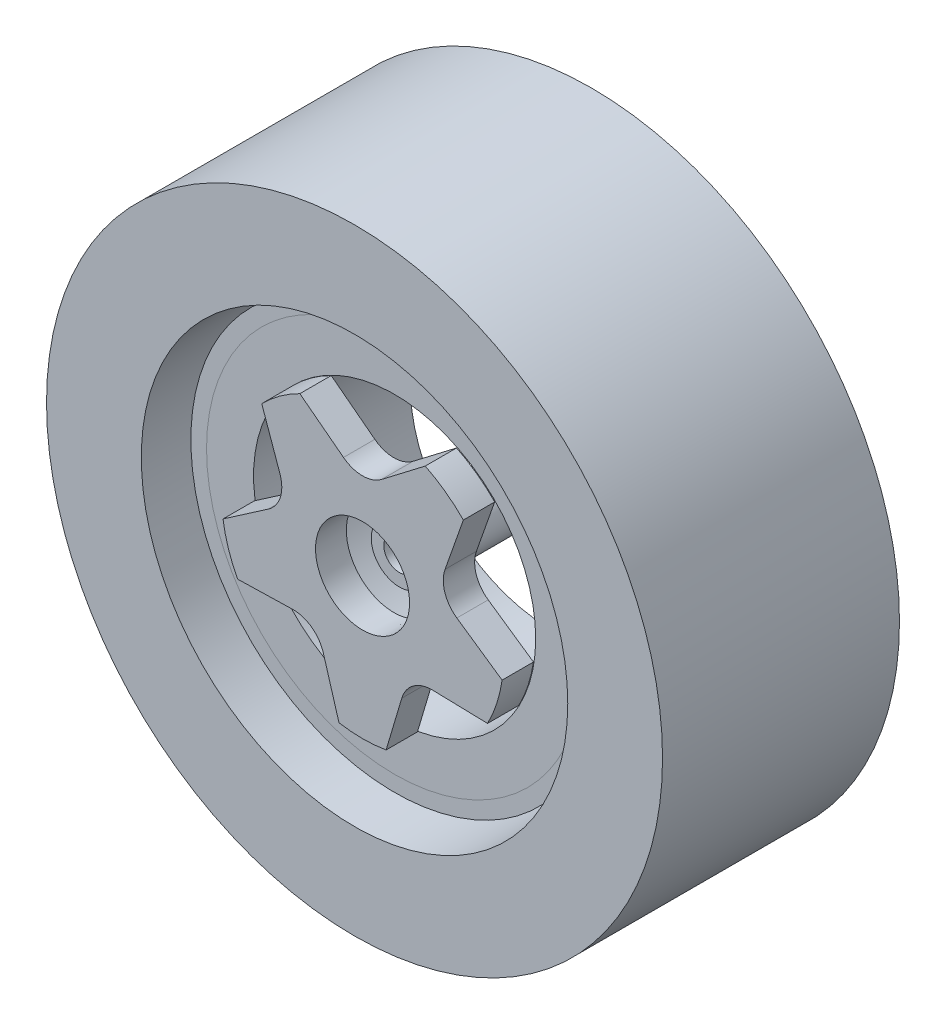
ISO-10303-21;
HEADER;
FILE_DESCRIPTION(('STEP AP214'),'2;1');
FILE_NAME('part.step','',(''),(''),'','','');
FILE_SCHEMA(('AUTOMOTIVE_DESIGN { 1 0 10303 214 1 1 1 1 }'));
ENDSEC;
DATA;
#1=APPLICATION_CONTEXT('core data for automotive mechanical design processes');
#2=APPLICATION_PROTOCOL_DEFINITION('international standard','automotive_design',2000,#1);
#3=PRODUCT_CONTEXT('',#1,'mechanical');
#4=PRODUCT('Part','Part','',(#3));
#5=PRODUCT_RELATED_PRODUCT_CATEGORY('part','',(#4));
#6=PRODUCT_DEFINITION_FORMATION('','',#4);
#7=PRODUCT_DEFINITION_CONTEXT('part definition',#1,'design');
#8=PRODUCT_DEFINITION('design','',#6,#7);
#9=PRODUCT_DEFINITION_SHAPE('','',#8);
#10=(LENGTH_UNIT() NAMED_UNIT(*) SI_UNIT(.MILLI.,.METRE.));
#11=(NAMED_UNIT(*) PLANE_ANGLE_UNIT() SI_UNIT($,.RADIAN.));
#12=(NAMED_UNIT(*) SI_UNIT($,.STERADIAN.) SOLID_ANGLE_UNIT());
#13=UNCERTAINTY_MEASURE_WITH_UNIT(LENGTH_MEASURE(1.E-05),#10,'distance_accuracy_value','');
#14=(GEOMETRIC_REPRESENTATION_CONTEXT(3) GLOBAL_UNCERTAINTY_ASSIGNED_CONTEXT((#13)) GLOBAL_UNIT_ASSIGNED_CONTEXT((#10,
#11,#12)) REPRESENTATION_CONTEXT('',''));
#15=CARTESIAN_POINT('',(0.,0.,0.));
#16=DIRECTION('',(0.,0.,1.));
#17=DIRECTION('',(1.,0.,0.));
#18=AXIS2_PLACEMENT_3D('',#15,#16,#17);
#19=CARTESIAN_POINT('',(0.,12.4349391802713,-20.2484380964273));
#20=DIRECTION('',(0.,0.,1.));
#21=DIRECTION('',(1.,0.,0.));
#22=AXIS2_PLACEMENT_3D('',#19,#20,#21);
#23=CYLINDRICAL_SURFACE('',#22,3.30769230769231);
#24=DIRECTION('',(0.,0.,1.));
#25=VECTOR('',#24,1.);
#26=CARTESIAN_POINT('',(2.0106806119193,9.80853634003165,-20.2484380964273));
#27=LINE('',#26,#25);
#28=CARTESIAN_POINT('',(2.0106806119193,9.80853634003165,23.8468131072976));
#29=VERTEX_POINT('',#28);
#30=CARTESIAN_POINT('',(2.0106806119193,9.80853634003165,27.1545054149899));
#31=VERTEX_POINT('',#30);
#32=EDGE_CURVE('E273',#29,#31,#27,.T.);
#33=ORIENTED_EDGE('',*,*,#32,.F.);
#34=CARTESIAN_POINT('',(0.,12.4349391802713,23.8468131072976));
#35=DIRECTION('',(0.,0.,1.));
#36=DIRECTION('',(1.,0.,0.));
#37=AXIS2_PLACEMENT_3D('',#34,#35,#36);
#38=CIRCLE('',#37,3.30769230769231);
#39=CARTESIAN_POINT('',(-2.01068061191929,9.80853634003165,23.8468131072976));
#40=VERTEX_POINT('',#39);
#41=EDGE_CURVE('E267',#29,#40,#38,.F.);
#42=ORIENTED_EDGE('',*,*,#41,.T.);
#43=DIRECTION('',(0.,0.,1.));
#44=VECTOR('',#43,1.);
#45=CARTESIAN_POINT('',(-2.01068061191929,9.80853634003165,-20.2484380964273));
#46=LINE('',#45,#44);
#47=CARTESIAN_POINT('',(-2.01068061191929,9.80853634003165,27.1545054149899));
#48=VERTEX_POINT('',#47);
#49=EDGE_CURVE('E339',#40,#48,#46,.T.);
#50=ORIENTED_EDGE('',*,*,#49,.T.);
#51=CARTESIAN_POINT('',(0.,12.4349391802713,27.1545054149899));
#52=DIRECTION('',(0.,0.,1.));
#53=DIRECTION('',(1.,0.,0.));
#54=AXIS2_PLACEMENT_3D('',#51,#52,#53);
#55=CIRCLE('',#54,3.30769230769231);
#56=EDGE_CURVE('E336',#48,#31,#55,.T.);
#57=ORIENTED_EDGE('',*,*,#56,.T.);
#58=EDGE_LOOP('',(#33,#42,#50,#57));
#59=FACE_BOUND('',#58,.T.);
#60=ADVANCED_FACE('F124',(#59),#23,.F.);
#61=CARTESIAN_POINT('',(3.99134561101594,5.21359851336303,-20.2484380964273));
#62=DIRECTION('',(-0.607880184998852,-0.794028765653841,0.));
#63=DIRECTION('',(0.794028765653841,-0.607880184998852,0.));
#64=AXIS2_PLACEMENT_3D('',#61,#62,#63);
#65=PLANE('',#64);
#66=ORIENTED_EDGE('',*,*,#49,.F.);
#67=DIRECTION('',(-0.794028765653841,0.607880184998852,0.));
#68=VECTOR('',#67,1.);
#69=CARTESIAN_POINT('',(3.99134561101594,5.21359851336303,23.8468131072976));
#70=LINE('',#69,#68);
#71=CARTESIAN_POINT('',(-6.61538461538461,13.3337339683399,23.8468131072976));
#72=VERTEX_POINT('',#71);
#73=EDGE_CURVE('E647',#40,#72,#70,.T.);
#74=ORIENTED_EDGE('',*,*,#73,.T.);
#75=DIRECTION('',(0.,0.,1.));
#76=VECTOR('',#75,1.);
#77=CARTESIAN_POINT('',(-6.61538461538461,13.3337339683399,-20.2484380964273));
#78=LINE('',#77,#76);
#79=CARTESIAN_POINT('',(-6.61538461538461,13.3337339683399,27.1545054149899));
#80=VERTEX_POINT('',#79);
#81=EDGE_CURVE('E341',#72,#80,#78,.T.);
#82=ORIENTED_EDGE('',*,*,#81,.T.);
#83=DIRECTION('',(0.794028765653841,-0.607880184998852,0.));
#84=VECTOR('',#83,1.);
#85=CARTESIAN_POINT('',(3.99134561101594,5.21359851336303,27.1545054149899));
#86=LINE('',#85,#84);
#87=EDGE_CURVE('E333',#80,#48,#86,.T.);
#88=ORIENTED_EDGE('',*,*,#87,.T.);
#89=EDGE_LOOP('',(#66,#74,#82,#88));
#90=FACE_BOUND('',#89,.T.);
#91=ADVANCED_FACE('F398',(#90),#65,.F.);
#92=CARTESIAN_POINT('',(0.,0.,-20.2484380964273));
#93=DIRECTION('',(0.,0.,1.));
#94=DIRECTION('',(1.,0.,0.));
#95=AXIS2_PLACEMENT_3D('',#92,#93,#94);
#96=CYLINDRICAL_SURFACE('',#95,14.8846153846154);
#97=CARTESIAN_POINT('',(0.,0.,23.8468131072976));
#98=DIRECTION('',(0.,0.,1.));
#99=DIRECTION('',(1.,0.,0.));
#100=AXIS2_PLACEMENT_3D('',#97,#98,#99);
#101=CIRCLE('',#100,14.8846153846154);
#102=CARTESIAN_POINT('',(-10.6368683066552,10.4119550409519,23.8468131072976));
#103=VERTEX_POINT('',#102);
#104=EDGE_CURVE('E645',#103,#72,#101,.F.);
#105=ORIENTED_EDGE('',*,*,#104,.F.);
#106=DIRECTION('',(0.,0.,1.));
#107=VECTOR('',#106,1.);
#108=CARTESIAN_POINT('',(-10.6368683066552,10.4119550409519,-20.2484380964273));
#109=LINE('',#108,#107);
#110=CARTESIAN_POINT('',(-10.6368683066552,10.4119550409519,27.1545054149899));
#111=VERTEX_POINT('',#110);
#112=EDGE_CURVE('E343',#103,#111,#109,.T.);
#113=ORIENTED_EDGE('',*,*,#112,.T.);
#114=CARTESIAN_POINT('',(0.,0.,27.1545054149899));
#115=DIRECTION('',(0.,0.,1.));
#116=DIRECTION('',(1.,0.,0.));
#117=AXIS2_PLACEMENT_3D('',#114,#115,#116);
#118=CIRCLE('',#117,14.8846153846154);
#119=EDGE_CURVE('E330',#80,#111,#118,.T.);
#120=ORIENTED_EDGE('',*,*,#119,.F.);
#121=ORIENTED_EDGE('',*,*,#81,.F.);
#122=EDGE_LOOP('',(#105,#113,#120,#121));
#123=FACE_BOUND('',#122,.T.);
#124=ADVANCED_FACE('F403',(#123),#96,.T.);
#125=CARTESIAN_POINT('',(-6.19182046370844,-2.18490470966556,-20.2484380964273));
#126=DIRECTION('',(0.943011539409318,0.332760028460251,0.));
#127=DIRECTION('',(-0.332760028460251,0.943011539409319,0.));
#128=AXIS2_PLACEMENT_3D('',#125,#126,#127);
#129=PLANE('',#128);
#130=ORIENTED_EDGE('',*,*,#112,.F.);
#131=DIRECTION('',(0.332760028460251,-0.943011539409319,0.));
#132=VECTOR('',#131,1.);
#133=CARTESIAN_POINT('',(-6.19182046370844,-2.18490470966556,23.8468131072976));
#134=LINE('',#133,#132);
#135=CARTESIAN_POINT('',(-8.70713792216158,4.9432753171683,23.8468131072976));
#136=VERTEX_POINT('',#135);
#137=EDGE_CURVE('E642',#103,#136,#134,.T.);
#138=ORIENTED_EDGE('',*,*,#137,.T.);
#139=DIRECTION('',(0.,0.,1.));
#140=VECTOR('',#139,1.);
#141=CARTESIAN_POINT('',(-8.70713792216158,4.9432753171683,-20.2484380964273));
#142=LINE('',#141,#140);
#143=CARTESIAN_POINT('',(-8.70713792216158,4.9432753171683,27.1545054149899));
#144=VERTEX_POINT('',#143);
#145=EDGE_CURVE('E345',#136,#144,#142,.T.);
#146=ORIENTED_EDGE('',*,*,#145,.T.);
#147=DIRECTION('',(-0.332760028460251,0.943011539409319,0.));
#148=VECTOR('',#147,1.);
#149=CARTESIAN_POINT('',(-6.19182046370844,-2.18490470966556,27.1545054149899));
#150=LINE('',#149,#148);
#151=EDGE_CURVE('E327',#144,#111,#150,.T.);
#152=ORIENTED_EDGE('',*,*,#151,.T.);
#153=EDGE_LOOP('',(#130,#138,#146,#152));
#154=FACE_BOUND('',#153,.T.);
#155=ADVANCED_FACE('F409',(#154),#129,.F.);
#156=CARTESIAN_POINT('',(-11.8263299371309,3.84260753072283,-20.2484380964273));
#157=DIRECTION('',(0.,0.,1.));
#158=DIRECTION('',(1.,0.,0.));
#159=AXIS2_PLACEMENT_3D('',#156,#157,#158);
#160=CYLINDRICAL_SURFACE('',#159,3.30769230769231);
#161=ORIENTED_EDGE('',*,*,#145,.F.);
#162=CARTESIAN_POINT('',(-11.8263299371309,3.84260753072283,23.8468131072976));
#163=DIRECTION('',(0.,0.,1.));
#164=DIRECTION('',(1.,0.,0.));
#165=AXIS2_PLACEMENT_3D('',#162,#163,#164);
#166=CIRCLE('',#165,3.30769230769231);
#167=CARTESIAN_POINT('',(-9.94980688084818,1.11873352085997,23.8468131072976));
#168=VERTEX_POINT('',#167);
#169=EDGE_CURVE('E639',#136,#168,#166,.F.);
#170=ORIENTED_EDGE('',*,*,#169,.T.);
#171=DIRECTION('',(0.,0.,1.));
#172=VECTOR('',#171,1.);
#173=CARTESIAN_POINT('',(-9.94980688084818,1.11873352085997,-20.2484380964273));
#174=LINE('',#173,#172);
#175=CARTESIAN_POINT('',(-9.94980688084818,1.11873352085997,27.1545054149899));
#176=VERTEX_POINT('',#175);
#177=EDGE_CURVE('E347',#168,#176,#174,.T.);
#178=ORIENTED_EDGE('',*,*,#177,.T.);
#179=CARTESIAN_POINT('',(-11.8263299371309,3.84260753072283,27.1545054149899));
#180=DIRECTION('',(0.,0.,1.));
#181=DIRECTION('',(1.,0.,0.));
#182=AXIS2_PLACEMENT_3D('',#179,#180,#181);
#183=CIRCLE('',#182,3.30769230769231);
#184=EDGE_CURVE('E324',#176,#144,#183,.T.);
#185=ORIENTED_EDGE('',*,*,#184,.T.);
#186=EDGE_LOOP('',(#161,#170,#178,#185));
#187=FACE_BOUND('',#186,.T.);
#188=ADVANCED_FACE('F413',(#187),#160,.F.);
#189=CARTESIAN_POINT('',(-3.72503321525279,5.40708579461994,-20.2484380964273));
#190=DIRECTION('',(0.567320923992441,-0.823496793679467,0.));
#191=DIRECTION('',(0.823496793679467,0.567320923992441,0.));
#192=AXIS2_PLACEMENT_3D('',#189,#190,#191);
#193=PLANE('',#192);
#194=ORIENTED_EDGE('',*,*,#177,.F.);
#195=DIRECTION('',(-0.823496793679467,-0.567320923992441,0.));
#196=VECTOR('',#195,1.);
#197=CARTESIAN_POINT('',(-3.72503321525279,5.40708579461994,23.8468131072976));
#198=LINE('',#197,#196);
#199=CARTESIAN_POINT('',(-14.7254008476161,-2.17125425156854,23.8468131072976));
#200=VERTEX_POINT('',#199);
#201=EDGE_CURVE('E636',#168,#200,#198,.T.);
#202=ORIENTED_EDGE('',*,*,#201,.T.);
#203=DIRECTION('',(0.,0.,1.));
#204=VECTOR('',#203,1.);
#205=CARTESIAN_POINT('',(-14.7254008476161,-2.17125425156854,-20.2484380964273));
#206=LINE('',#205,#204);
#207=CARTESIAN_POINT('',(-14.7254008476161,-2.17125425156854,27.1545054149899));
#208=VERTEX_POINT('',#207);
#209=EDGE_CURVE('E349',#200,#208,#206,.T.);
#210=ORIENTED_EDGE('',*,*,#209,.T.);
#211=DIRECTION('',(0.823496793679467,0.567320923992441,0.));
#212=VECTOR('',#211,1.);
#213=CARTESIAN_POINT('',(-3.72503321525279,5.40708579461994,27.1545054149899));
#214=LINE('',#213,#212);
#215=EDGE_CURVE('E321',#208,#176,#214,.T.);
#216=ORIENTED_EDGE('',*,*,#215,.T.);
#217=EDGE_LOOP('',(#194,#202,#210,#216));
#218=FACE_BOUND('',#217,.T.);
#219=ADVANCED_FACE('F417',(#218),#193,.F.);
#220=CARTESIAN_POINT('',(0.,0.,-20.2484380964273));
#221=DIRECTION('',(0.,0.,1.));
#222=DIRECTION('',(1.,0.,0.));
#223=AXIS2_PLACEMENT_3D('',#220,#221,#222);
#224=CYLINDRICAL_SURFACE('',#223,14.8846153846154);
#225=CARTESIAN_POINT('',(0.,0.,23.8468131072976));
#226=DIRECTION('',(0.,0.,1.));
#227=DIRECTION('',(1.,0.,0.));
#228=AXIS2_PLACEMENT_3D('',#225,#226,#227);
#229=CIRCLE('',#228,14.8846153846154);
#230=CARTESIAN_POINT('',(-13.1893307627542,-6.89879186369578,23.8468131072976));
#231=VERTEX_POINT('',#230);
#232=EDGE_CURVE('E634',#231,#200,#229,.F.);
#233=ORIENTED_EDGE('',*,*,#232,.F.);
#234=DIRECTION('',(0.,0.,1.));
#235=VECTOR('',#234,1.);
#236=CARTESIAN_POINT('',(-13.1893307627542,-6.89879186369578,-20.2484380964273));
#237=LINE('',#236,#235);
#238=CARTESIAN_POINT('',(-13.1893307627542,-6.89879186369578,27.1545054149899));
#239=VERTEX_POINT('',#238);
#240=EDGE_CURVE('E351',#231,#239,#237,.T.);
#241=ORIENTED_EDGE('',*,*,#240,.T.);
#242=CARTESIAN_POINT('',(0.,0.,27.1545054149899));
#243=DIRECTION('',(0.,0.,1.));
#244=DIRECTION('',(1.,0.,0.));
#245=AXIS2_PLACEMENT_3D('',#242,#243,#244);
#246=CIRCLE('',#245,14.8846153846154);
#247=EDGE_CURVE('E318',#208,#239,#246,.T.);
#248=ORIENTED_EDGE('',*,*,#247,.F.);
#249=ORIENTED_EDGE('',*,*,#209,.F.);
#250=EDGE_LOOP('',(#233,#241,#248,#249));
#251=FACE_BOUND('',#250,.T.);
#252=ADVANCED_FACE('F421',(#251),#224,.T.);
#253=CARTESIAN_POINT('',(0.164590112206944,-6.56394388611612,-20.2484380964273));
#254=DIRECTION('',(-0.025067001860525,0.999685773339665,0.));
#255=DIRECTION('',(-0.999685773339665,-0.025067001860525,0.));
#256=AXIS2_PLACEMENT_3D('',#253,#254,#255);
#257=PLANE('',#256);
#258=ORIENTED_EDGE('',*,*,#240,.F.);
#259=DIRECTION('',(0.999685773339665,0.025067001860525,0.));
#260=VECTOR('',#259,1.);
#261=CARTESIAN_POINT('',(0.164590112206944,-6.56394388611612,23.8468131072976));
#262=LINE('',#261,#260);
#263=CARTESIAN_POINT('',(-7.39198779254838,-6.75342417827323,23.8468131072976));
#264=VERTEX_POINT('',#263);
#265=EDGE_CURVE('E631',#231,#264,#262,.T.);
#266=ORIENTED_EDGE('',*,*,#265,.T.);
#267=DIRECTION('',(0.,0.,1.));
#268=VECTOR('',#267,1.);
#269=CARTESIAN_POINT('',(-7.39198779254838,-6.75342417827323,-20.2484380964273));
#270=LINE('',#269,#268);
#271=CARTESIAN_POINT('',(-7.39198779254838,-6.75342417827323,27.1545054149899));
#272=VERTEX_POINT('',#271);
#273=EDGE_CURVE('E353',#264,#272,#270,.T.);
#274=ORIENTED_EDGE('',*,*,#273,.T.);
#275=DIRECTION('',(-0.999685773339665,-0.025067001860525,0.));
#276=VECTOR('',#275,1.);
#277=CARTESIAN_POINT('',(0.164590112206944,-6.56394388611612,27.1545054149899));
#278=LINE('',#277,#276);
#279=EDGE_CURVE('E315',#272,#239,#278,.T.);
#280=ORIENTED_EDGE('',*,*,#279,.T.);
#281=EDGE_LOOP('',(#258,#266,#274,#280));
#282=FACE_BOUND('',#281,.T.);
#283=ADVANCED_FACE('F425',(#282),#257,.F.);
#284=CARTESIAN_POINT('',(-7.30907386331739,-10.0600771208583,-20.2484380964273));
#285=DIRECTION('',(0.,0.,1.));
#286=DIRECTION('',(1.,0.,0.));
#287=AXIS2_PLACEMENT_3D('',#284,#285,#286);
#288=CYLINDRICAL_SURFACE('',#287,3.30769230769231);
#289=ORIENTED_EDGE('',*,*,#273,.F.);
#290=CARTESIAN_POINT('',(-7.30907386331739,-10.0600771208583,23.8468131072976));
#291=DIRECTION('',(0.,0.,1.));
#292=DIRECTION('',(1.,0.,0.));
#293=AXIS2_PLACEMENT_3D('',#290,#291,#292);
#294=CIRCLE('',#293,3.30769230769231);
#295=CARTESIAN_POINT('',(-4.13863822194255,-9.11712099978639,23.8468131072976));
#296=VERTEX_POINT('',#295);
#297=EDGE_CURVE('E628',#264,#296,#294,.F.);
#298=ORIENTED_EDGE('',*,*,#297,.T.);
#299=DIRECTION('',(0.,0.,1.));
#300=VECTOR('',#299,1.);
#301=CARTESIAN_POINT('',(-4.13863822194255,-9.11712099978639,-20.2484380964273));
#302=LINE('',#301,#300);
#303=CARTESIAN_POINT('',(-4.13863822194255,-9.11712099978639,27.1545054149899));
#304=VERTEX_POINT('',#303);
#305=EDGE_CURVE('E355',#296,#304,#302,.T.);
#306=ORIENTED_EDGE('',*,*,#305,.T.);
#307=CARTESIAN_POINT('',(-7.30907386331739,-10.0600771208583,27.1545054149899));
#308=DIRECTION('',(0.,0.,1.));
#309=DIRECTION('',(1.,0.,0.));
#310=AXIS2_PLACEMENT_3D('',#307,#308,#309);
#311=CIRCLE('',#310,3.30769230769231);
#312=EDGE_CURVE('E312',#304,#272,#311,.T.);
#313=ORIENTED_EDGE('',*,*,#312,.T.);
#314=EDGE_LOOP('',(#289,#298,#306,#313));
#315=FACE_BOUND('',#314,.T.);
#316=ADVANCED_FACE('F429',(#315),#288,.F.);
#317=CARTESIAN_POINT('',(-6.29354274726452,-1.87183571220115,-20.2484380964273));
#318=DIRECTION('',(0.958503798555184,0.285079757533366,0.));
#319=DIRECTION('',(-0.285079757533366,0.958503798555184,0.));
#320=AXIS2_PLACEMENT_3D('',#317,#318,#319);
#321=PLANE('',#320);
#322=ORIENTED_EDGE('',*,*,#305,.F.);
#323=DIRECTION('',(0.285079757533366,-0.958503798555184,0.));
#324=VECTOR('',#323,1.);
#325=CARTESIAN_POINT('',(-6.29354274726452,-1.87183571220115,23.8468131072976));
#326=LINE('',#325,#324);
#327=CARTESIAN_POINT('',(-2.48541360640879,-14.6756428940271,23.8468131072976));
#328=VERTEX_POINT('',#327);
#329=EDGE_CURVE('E625',#296,#328,#326,.T.);
#330=ORIENTED_EDGE('',*,*,#329,.T.);
#331=DIRECTION('',(0.,0.,1.));
#332=VECTOR('',#331,1.);
#333=CARTESIAN_POINT('',(-2.48541360640879,-14.6756428940271,-20.2484380964273));
#334=LINE('',#333,#332);
#335=CARTESIAN_POINT('',(-2.48541360640879,-14.6756428940271,27.1545054149899));
#336=VERTEX_POINT('',#335);
#337=EDGE_CURVE('E357',#328,#336,#334,.T.);
#338=ORIENTED_EDGE('',*,*,#337,.T.);
#339=DIRECTION('',(-0.285079757533366,0.958503798555184,0.));
#340=VECTOR('',#339,1.);
#341=CARTESIAN_POINT('',(-6.29354274726452,-1.87183571220115,27.1545054149899));
#342=LINE('',#341,#340);
#343=EDGE_CURVE('E309',#336,#304,#342,.T.);
#344=ORIENTED_EDGE('',*,*,#343,.T.);
#345=EDGE_LOOP('',(#322,#330,#338,#344));
#346=FACE_BOUND('',#345,.T.);
#347=ADVANCED_FACE('F433',(#346),#321,.F.);
#348=CARTESIAN_POINT('',(0.,0.,-20.2484380964273));
#349=DIRECTION('',(0.,0.,1.));
#350=DIRECTION('',(1.,0.,0.));
#351=AXIS2_PLACEMENT_3D('',#348,#349,#350);
#352=CYLINDRICAL_SURFACE('',#351,14.8846153846154);
#353=CARTESIAN_POINT('',(0.,0.,23.8468131072976));
#354=DIRECTION('',(0.,0.,1.));
#355=DIRECTION('',(1.,0.,0.));
#356=AXIS2_PLACEMENT_3D('',#353,#354,#355);
#357=CIRCLE('',#356,14.8846153846154);
#358=CARTESIAN_POINT('',(2.48541360640858,-14.6756428940271,23.8468131072976));
#359=VERTEX_POINT('',#358);
#360=EDGE_CURVE('E623',#359,#328,#357,.F.);
#361=ORIENTED_EDGE('',*,*,#360,.F.);
#362=DIRECTION('',(0.,0.,1.));
#363=VECTOR('',#362,1.);
#364=CARTESIAN_POINT('',(2.48541360640858,-14.6756428940271,-20.2484380964273));
#365=LINE('',#364,#363);
#366=CARTESIAN_POINT('',(2.48541360640858,-14.6756428940271,27.1545054149899));
#367=VERTEX_POINT('',#366);
#368=EDGE_CURVE('E359',#359,#367,#365,.T.);
#369=ORIENTED_EDGE('',*,*,#368,.T.);
#370=CARTESIAN_POINT('',(0.,0.,27.1545054149899));
#371=DIRECTION('',(0.,0.,1.));
#372=DIRECTION('',(1.,0.,0.));
#373=AXIS2_PLACEMENT_3D('',#370,#371,#372);
#374=CIRCLE('',#373,14.8846153846154);
#375=EDGE_CURVE('E306',#336,#367,#374,.T.);
#376=ORIENTED_EDGE('',*,*,#375,.F.);
#377=ORIENTED_EDGE('',*,*,#337,.F.);
#378=EDGE_LOOP('',(#361,#369,#376,#377));
#379=FACE_BOUND('',#378,.T.);
#380=ADVANCED_FACE('F437',(#379),#352,.T.);
#381=CARTESIAN_POINT('',(6.2935427472645,-1.87183571220124,-20.2484380964273));
#382=DIRECTION('',(-0.95850379855518,0.28507975753338,0.));
#383=DIRECTION('',(-0.28507975753338,-0.95850379855518,0.));
#384=AXIS2_PLACEMENT_3D('',#381,#382,#383);
#385=PLANE('',#384);
#386=ORIENTED_EDGE('',*,*,#368,.F.);
#387=DIRECTION('',(0.28507975753338,0.95850379855518,0.));
#388=VECTOR('',#387,1.);
#389=CARTESIAN_POINT('',(6.2935427472645,-1.87183571220124,23.8468131072976));
#390=LINE('',#389,#388);
#391=CARTESIAN_POINT('',(4.13863822194242,-9.11712099978645,23.8468131072976));
#392=VERTEX_POINT('',#391);
#393=EDGE_CURVE('E620',#359,#392,#390,.T.);
#394=ORIENTED_EDGE('',*,*,#393,.T.);
#395=DIRECTION('',(0.,0.,1.));
#396=VECTOR('',#395,1.);
#397=CARTESIAN_POINT('',(4.13863822194242,-9.11712099978645,-20.2484380964273));
#398=LINE('',#397,#396);
#399=CARTESIAN_POINT('',(4.13863822194242,-9.11712099978645,27.1545054149899));
#400=VERTEX_POINT('',#399);
#401=EDGE_CURVE('E361',#392,#400,#398,.T.);
#402=ORIENTED_EDGE('',*,*,#401,.T.);
#403=DIRECTION('',(-0.28507975753338,-0.95850379855518,0.));
#404=VECTOR('',#403,1.);
#405=CARTESIAN_POINT('',(6.2935427472645,-1.87183571220124,27.1545054149899));
#406=LINE('',#405,#404);
#407=EDGE_CURVE('E303',#400,#367,#406,.T.);
#408=ORIENTED_EDGE('',*,*,#407,.T.);
#409=EDGE_LOOP('',(#386,#394,#402,#408));
#410=FACE_BOUND('',#409,.T.);
#411=ADVANCED_FACE('F441',(#410),#385,.F.);
#412=CARTESIAN_POINT('',(7.30907386331725,-10.0600771208584,-20.2484380964273));
#413=DIRECTION('',(0.,0.,1.));
#414=DIRECTION('',(1.,0.,0.));
#415=AXIS2_PLACEMENT_3D('',#412,#413,#414);
#416=CYLINDRICAL_SURFACE('',#415,3.30769230769231);
#417=ORIENTED_EDGE('',*,*,#401,.F.);
#418=CARTESIAN_POINT('',(7.30907386331725,-10.0600771208584,23.8468131072976));
#419=DIRECTION('',(0.,0.,1.));
#420=DIRECTION('',(1.,0.,0.));
#421=AXIS2_PLACEMENT_3D('',#418,#419,#420);
#422=CIRCLE('',#421,3.30769230769231);
#423=CARTESIAN_POINT('',(7.39198779254829,-6.75342417827334,23.8468131072976));
#424=VERTEX_POINT('',#423);
#425=EDGE_CURVE('E617',#392,#424,#422,.F.);
#426=ORIENTED_EDGE('',*,*,#425,.T.);
#427=DIRECTION('',(0.,0.,1.));
#428=VECTOR('',#427,1.);
#429=CARTESIAN_POINT('',(7.39198779254829,-6.75342417827334,-20.2484380964273));
#430=LINE('',#429,#428);
#431=CARTESIAN_POINT('',(7.39198779254829,-6.75342417827334,27.1545054149899));
#432=VERTEX_POINT('',#431);
#433=EDGE_CURVE('E363',#424,#432,#430,.T.);
#434=ORIENTED_EDGE('',*,*,#433,.T.);
#435=CARTESIAN_POINT('',(7.30907386331725,-10.0600771208584,27.1545054149899));
#436=DIRECTION('',(0.,0.,1.));
#437=DIRECTION('',(1.,0.,0.));
#438=AXIS2_PLACEMENT_3D('',#435,#436,#437);
#439=CIRCLE('',#438,3.30769230769231);
#440=EDGE_CURVE('E300',#432,#400,#439,.T.);
#441=ORIENTED_EDGE('',*,*,#440,.T.);
#442=EDGE_LOOP('',(#417,#426,#434,#441));
#443=FACE_BOUND('',#442,.T.);
#444=ADVANCED_FACE('F445',(#443),#416,.F.);
#445=CARTESIAN_POINT('',(-0.164590112207027,-6.56394388611612,-20.2484380964273));
#446=DIRECTION('',(0.0250670018605397,0.999685773339665,0.));
#447=DIRECTION('',(-0.999685773339665,0.0250670018605397,0.));
#448=AXIS2_PLACEMENT_3D('',#445,#446,#447);
#449=PLANE('',#448);
#450=ORIENTED_EDGE('',*,*,#433,.F.);
#451=DIRECTION('',(0.999685773339665,-0.0250670018605397,0.));
#452=VECTOR('',#451,1.);
#453=CARTESIAN_POINT('',(-0.164590112207027,-6.56394388611612,23.8468131072976));
#454=LINE('',#453,#452);
#455=CARTESIAN_POINT('',(13.1893307627541,-6.89879186369599,23.8468131072976));
#456=VERTEX_POINT('',#455);
#457=EDGE_CURVE('E612',#424,#456,#454,.T.);
#458=ORIENTED_EDGE('',*,*,#457,.T.);
#459=DIRECTION('',(0.,0.,1.));
#460=VECTOR('',#459,1.);
#461=CARTESIAN_POINT('',(13.1893307627541,-6.89879186369599,-20.2484380964273));
#462=LINE('',#461,#460);
#463=CARTESIAN_POINT('',(13.1893307627541,-6.89879186369599,27.1545054149899));
#464=VERTEX_POINT('',#463);
#465=EDGE_CURVE('E365',#456,#464,#462,.T.);
#466=ORIENTED_EDGE('',*,*,#465,.T.);
#467=DIRECTION('',(-0.999685773339665,0.0250670018605397,0.));
#468=VECTOR('',#467,1.);
#469=CARTESIAN_POINT('',(-0.164590112207027,-6.56394388611612,27.1545054149899));
#470=LINE('',#469,#468);
#471=EDGE_CURVE('E297',#464,#432,#470,.T.);
#472=ORIENTED_EDGE('',*,*,#471,.T.);
#473=EDGE_LOOP('',(#450,#458,#466,#472));
#474=FACE_BOUND('',#473,.T.);
#475=ADVANCED_FACE('F449',(#474),#449,.F.);
#476=CARTESIAN_POINT('',(0.,0.,-20.2484380964273));
#477=DIRECTION('',(0.,0.,1.));
#478=DIRECTION('',(1.,0.,0.));
#479=AXIS2_PLACEMENT_3D('',#476,#477,#478);
#480=CYLINDRICAL_SURFACE('',#479,14.8846153846154);
#481=CARTESIAN_POINT('',(0.,0.,23.8468131072976));
#482=DIRECTION('',(0.,0.,1.));
#483=DIRECTION('',(1.,0.,0.));
#484=AXIS2_PLACEMENT_3D('',#481,#482,#483);
#485=CIRCLE('',#484,14.8846153846154);
#486=CARTESIAN_POINT('',(14.7254008476161,-2.17125425156876,23.8468131072976));
#487=VERTEX_POINT('',#486);
#488=EDGE_CURVE('E611',#487,#456,#485,.F.);
#489=ORIENTED_EDGE('',*,*,#488,.F.);
#490=DIRECTION('',(0.,0.,1.));
#491=VECTOR('',#490,1.);
#492=CARTESIAN_POINT('',(14.7254008476161,-2.17125425156876,-20.2484380964273));
#493=LINE('',#492,#491);
#494=CARTESIAN_POINT('',(14.7254008476161,-2.17125425156876,27.1545054149899));
#495=VERTEX_POINT('',#494);
#496=EDGE_CURVE('E367',#487,#495,#493,.T.);
#497=ORIENTED_EDGE('',*,*,#496,.T.);
#498=CARTESIAN_POINT('',(0.,0.,27.1545054149899));
#499=DIRECTION('',(0.,0.,1.));
#500=DIRECTION('',(1.,0.,0.));
#501=AXIS2_PLACEMENT_3D('',#498,#499,#500);
#502=CIRCLE('',#501,14.8846153846154);
#503=EDGE_CURVE('E294',#464,#495,#502,.T.);
#504=ORIENTED_EDGE('',*,*,#503,.F.);
#505=ORIENTED_EDGE('',*,*,#465,.F.);
#506=EDGE_LOOP('',(#489,#497,#504,#505));
#507=FACE_BOUND('',#506,.T.);
#508=ADVANCED_FACE('F453',(#507),#480,.T.);
#509=CARTESIAN_POINT('',(3.72503321525288,5.40708579461989,-20.2484380964273));
#510=DIRECTION('',(-0.567320923992453,-0.823496793679459,0.));
#511=DIRECTION('',(0.823496793679459,-0.567320923992453,0.));
#512=AXIS2_PLACEMENT_3D('',#509,#510,#511);
#513=PLANE('',#512);
#514=ORIENTED_EDGE('',*,*,#496,.F.);
#515=DIRECTION('',(-0.823496793679459,0.567320923992453,0.));
#516=VECTOR('',#515,1.);
#517=CARTESIAN_POINT('',(3.72503321525288,5.40708579461989,23.8468131072976));
#518=LINE('',#517,#516);
#519=CARTESIAN_POINT('',(9.94980688084821,1.11873352085982,23.8468131072976));
#520=VERTEX_POINT('',#519);
#521=EDGE_CURVE('E379',#487,#520,#518,.T.);
#522=ORIENTED_EDGE('',*,*,#521,.T.);
#523=DIRECTION('',(0.,0.,1.));
#524=VECTOR('',#523,1.);
#525=CARTESIAN_POINT('',(9.94980688084821,1.11873352085982,-20.2484380964273));
#526=LINE('',#525,#524);
#527=CARTESIAN_POINT('',(9.94980688084821,1.11873352085982,27.1545054149899));
#528=VERTEX_POINT('',#527);
#529=EDGE_CURVE('E369',#520,#528,#526,.T.);
#530=ORIENTED_EDGE('',*,*,#529,.T.);
#531=DIRECTION('',(0.823496793679459,-0.567320923992453,0.));
#532=VECTOR('',#531,1.);
#533=CARTESIAN_POINT('',(3.72503321525288,5.40708579461989,27.1545054149899));
#534=LINE('',#533,#532);
#535=EDGE_CURVE('E291',#528,#495,#534,.T.);
#536=ORIENTED_EDGE('',*,*,#535,.T.);
#537=EDGE_LOOP('',(#514,#522,#530,#536));
#538=FACE_BOUND('',#537,.T.);
#539=ADVANCED_FACE('F457',(#538),#513,.F.);
#540=CARTESIAN_POINT('',(11.8263299371309,3.84260753072266,-20.2484380964273));
#541=DIRECTION('',(0.,0.,1.));
#542=DIRECTION('',(1.,0.,0.));
#543=AXIS2_PLACEMENT_3D('',#540,#541,#542);
#544=CYLINDRICAL_SURFACE('',#543,3.30769230769231);
#545=ORIENTED_EDGE('',*,*,#529,.F.);
#546=CARTESIAN_POINT('',(11.8263299371309,3.84260753072266,23.8468131072976));
#547=DIRECTION('',(0.,0.,1.));
#548=DIRECTION('',(1.,0.,0.));
#549=AXIS2_PLACEMENT_3D('',#546,#547,#548);
#550=CIRCLE('',#549,3.30769230769231);
#551=CARTESIAN_POINT('',(8.70713792216166,4.94327531716817,23.8468131072976));
#552=VERTEX_POINT('',#551);
#553=EDGE_CURVE('E376',#520,#552,#550,.F.);
#554=ORIENTED_EDGE('',*,*,#553,.T.);
#555=DIRECTION('',(0.,0.,1.));
#556=VECTOR('',#555,1.);
#557=CARTESIAN_POINT('',(8.70713792216166,4.94327531716817,-20.2484380964273));
#558=LINE('',#557,#556);
#559=CARTESIAN_POINT('',(8.70713792216166,4.94327531716817,27.1545054149899));
#560=VERTEX_POINT('',#559);
#561=EDGE_CURVE('E371',#552,#560,#558,.T.);
#562=ORIENTED_EDGE('',*,*,#561,.T.);
#563=CARTESIAN_POINT('',(11.8263299371309,3.84260753072266,27.1545054149899));
#564=DIRECTION('',(0.,0.,1.));
#565=DIRECTION('',(1.,0.,0.));
#566=AXIS2_PLACEMENT_3D('',#563,#564,#565);
#567=CIRCLE('',#566,3.30769230769231);
#568=EDGE_CURVE('E285',#560,#528,#567,.T.);
#569=ORIENTED_EDGE('',*,*,#568,.T.);
#570=EDGE_LOOP('',(#545,#554,#562,#569));
#571=FACE_BOUND('',#570,.T.);
#572=ADVANCED_FACE('F461',(#571),#544,.F.);
#573=CARTESIAN_POINT('',(6.19182046370842,-2.18490470966565,-20.2484380964273));
#574=DIRECTION('',(-0.943011539409314,0.332760028460264,0.));
#575=DIRECTION('',(-0.332760028460264,-0.943011539409314,0.));
#576=AXIS2_PLACEMENT_3D('',#573,#574,#575);
#577=PLANE('',#576);
#578=ORIENTED_EDGE('',*,*,#561,.F.);
#579=DIRECTION('',(0.332760028460264,0.943011539409314,0.));
#580=VECTOR('',#579,1.);
#581=CARTESIAN_POINT('',(6.19182046370842,-2.18490470966565,23.8468131072976));
#582=LINE('',#581,#580);
#583=CARTESIAN_POINT('',(10.6368683066553,10.4119550409518,23.8468131072976));
#584=VERTEX_POINT('',#583);
#585=EDGE_CURVE('E144',#552,#584,#582,.T.);
#586=ORIENTED_EDGE('',*,*,#585,.T.);
#587=DIRECTION('',(0.,0.,1.));
#588=VECTOR('',#587,1.);
#589=CARTESIAN_POINT('',(10.6368683066553,10.4119550409518,-20.2484380964273));
#590=LINE('',#589,#588);
#591=CARTESIAN_POINT('',(10.6368683066553,10.4119550409518,27.1545054149899));
#592=VERTEX_POINT('',#591);
#593=EDGE_CURVE('E268',#584,#592,#590,.T.);
#594=ORIENTED_EDGE('',*,*,#593,.T.);
#595=DIRECTION('',(-0.332760028460265,-0.943011539409314,0.));
#596=VECTOR('',#595,1.);
#597=CARTESIAN_POINT('',(6.19182046370842,-2.18490470966565,27.1545054149899));
#598=LINE('',#597,#596);
#599=EDGE_CURVE('E283',#592,#560,#598,.T.);
#600=ORIENTED_EDGE('',*,*,#599,.T.);
#601=EDGE_LOOP('',(#578,#586,#594,#600));
#602=FACE_BOUND('',#601,.T.);
#603=ADVANCED_FACE('F374',(#602),#577,.F.);
#604=CARTESIAN_POINT('',(0.,0.,-20.2484380964273));
#605=DIRECTION('',(0.,0.,1.));
#606=DIRECTION('',(1.,0.,0.));
#607=AXIS2_PLACEMENT_3D('',#604,#605,#606);
#608=CYLINDRICAL_SURFACE('',#607,14.8846153846154);
#609=CARTESIAN_POINT('',(0.,0.,23.8468131072976));
#610=DIRECTION('',(0.,0.,1.));
#611=DIRECTION('',(1.,0.,0.));
#612=AXIS2_PLACEMENT_3D('',#609,#610,#611);
#613=CIRCLE('',#612,14.8846153846154);
#614=CARTESIAN_POINT('',(6.61538461538462,13.3337339683399,23.8468131072976));
#615=VERTEX_POINT('',#614);
#616=EDGE_CURVE('E139',#615,#584,#613,.F.);
#617=ORIENTED_EDGE('',*,*,#616,.F.);
#618=DIRECTION('',(0.,0.,1.));
#619=VECTOR('',#618,1.);
#620=CARTESIAN_POINT('',(6.61538461538462,13.3337339683399,-20.2484380964273));
#621=LINE('',#620,#619);
#622=CARTESIAN_POINT('',(6.61538461538462,13.3337339683399,27.1545054149899));
#623=VERTEX_POINT('',#622);
#624=EDGE_CURVE('E260',#615,#623,#621,.T.);
#625=ORIENTED_EDGE('',*,*,#624,.T.);
#626=CARTESIAN_POINT('',(0.,0.,27.1545054149899));
#627=DIRECTION('',(0.,0.,1.));
#628=DIRECTION('',(1.,0.,0.));
#629=AXIS2_PLACEMENT_3D('',#626,#627,#628);
#630=CIRCLE('',#629,14.8846153846154);
#631=EDGE_CURVE('E264',#592,#623,#630,.T.);
#632=ORIENTED_EDGE('',*,*,#631,.F.);
#633=ORIENTED_EDGE('',*,*,#593,.F.);
#634=EDGE_LOOP('',(#617,#625,#632,#633));
#635=FACE_BOUND('',#634,.T.);
#636=ADVANCED_FACE('F262',(#635),#608,.T.);
#637=CARTESIAN_POINT('',(-3.99134561101593,5.21359851336302,-20.2484380964273));
#638=DIRECTION('',(0.607880184998852,-0.794028765653841,0.));
#639=DIRECTION('',(0.794028765653841,0.607880184998852,0.));
#640=AXIS2_PLACEMENT_3D('',#637,#638,#639);
#641=PLANE('',#640);
#642=ORIENTED_EDGE('',*,*,#624,.F.);
#643=DIRECTION('',(-0.794028765653841,-0.607880184998852,0.));
#644=VECTOR('',#643,1.);
#645=CARTESIAN_POINT('',(-3.99134561101593,5.21359851336302,23.8468131072976));
#646=LINE('',#645,#644);
#647=EDGE_CURVE('E132',#615,#29,#646,.T.);
#648=ORIENTED_EDGE('',*,*,#647,.T.);
#649=ORIENTED_EDGE('',*,*,#32,.T.);
#650=DIRECTION('',(0.794028765653841,0.607880184998852,0.));
#651=VECTOR('',#650,1.);
#652=CARTESIAN_POINT('',(-3.99134561101593,5.21359851336302,27.1545054149899));
#653=LINE('',#652,#651);
#654=EDGE_CURVE('E270',#31,#623,#653,.T.);
#655=ORIENTED_EDGE('',*,*,#654,.T.);
#656=EDGE_LOOP('',(#642,#648,#649,#655));
#657=FACE_BOUND('',#656,.T.);
#658=ADVANCED_FACE('F271',(#657),#641,.F.);
#659=CARTESIAN_POINT('',(0.,0.,27.1545054149899));
#660=DIRECTION('',(0.,0.,1.));
#661=DIRECTION('',(1.,0.,0.));
#662=AXIS2_PLACEMENT_3D('',#659,#660,#661);
#663=PLANE('',#662);
#664=CARTESIAN_POINT('',(0.,0.,27.1545054149899));
#665=DIRECTION('',(0.,0.,1.));
#666=DIRECTION('',(1.,0.,0.));
#667=AXIS2_PLACEMENT_3D('',#664,#665,#666);
#668=CIRCLE('',#667,4.96153846153846);
#669=CARTESIAN_POINT('',(4.96153846153847,0.,27.1545054149899));
#670=VERTEX_POINT('',#669);
#671=EDGE_CURVE('E277',#670,#670,#668,.T.);
#672=ORIENTED_EDGE('',*,*,#671,.F.);
#673=EDGE_LOOP('',(#672));
#674=FACE_BOUND('',#673,.T.);
#675=ORIENTED_EDGE('',*,*,#654,.F.);
#676=ORIENTED_EDGE('',*,*,#56,.F.);
#677=ORIENTED_EDGE('',*,*,#87,.F.);
#678=ORIENTED_EDGE('',*,*,#119,.T.);
#679=ORIENTED_EDGE('',*,*,#151,.F.);
#680=ORIENTED_EDGE('',*,*,#184,.F.);
#681=ORIENTED_EDGE('',*,*,#215,.F.);
#682=ORIENTED_EDGE('',*,*,#247,.T.);
#683=ORIENTED_EDGE('',*,*,#279,.F.);
#684=ORIENTED_EDGE('',*,*,#312,.F.);
#685=ORIENTED_EDGE('',*,*,#343,.F.);
#686=ORIENTED_EDGE('',*,*,#375,.T.);
#687=ORIENTED_EDGE('',*,*,#407,.F.);
#688=ORIENTED_EDGE('',*,*,#440,.F.);
#689=ORIENTED_EDGE('',*,*,#471,.F.);
#690=ORIENTED_EDGE('',*,*,#503,.T.);
#691=ORIENTED_EDGE('',*,*,#535,.F.);
#692=ORIENTED_EDGE('',*,*,#568,.F.);
#693=ORIENTED_EDGE('',*,*,#599,.F.);
#694=ORIENTED_EDGE('',*,*,#631,.T.);
#695=EDGE_LOOP('',(#675,#676,#677,#678,#679,#680,#681,#682,#683,#684,#685,#686,#687,#688,#689,
#690,#691,#692,#693,#694));
#696=FACE_BOUND('',#695,.T.);
#697=ADVANCED_FACE('F280',(#674,#696),#663,.T.);
#698=CARTESIAN_POINT('',(0.,0.,27.1545054149899));
#699=DIRECTION('',(0.,0.,-1.));
#700=DIRECTION('',(1.,0.,0.));
#701=AXIS2_PLACEMENT_3D('',#698,#699,#700);
#702=CONICAL_SURFACE('',#701,4.96153846153846,0.0174532925199433);
#703=CARTESIAN_POINT('',(0.,0.,23.8468131072976));
#704=DIRECTION('',(0.,0.,1.));
#705=DIRECTION('',(1.,0.,0.));
#706=AXIS2_PLACEMENT_3D('',#703,#704,#705);
#707=CIRCLE('',#706,5.0192744455318);
#708=CARTESIAN_POINT('',(5.0192744455318,0.,23.8468131072976));
#709=VERTEX_POINT('',#708);
#710=EDGE_CURVE('E14',#709,#709,#707,.F.);
#711=ORIENTED_EDGE('',*,*,#710,.T.);
#712=EDGE_LOOP('',(#711));
#713=FACE_BOUND('',#712,.T.);
#714=ORIENTED_EDGE('',*,*,#671,.T.);
#715=EDGE_LOOP('',(#714));
#716=FACE_BOUND('',#715,.T.);
#717=ADVANCED_FACE('F126',(#713,#716),#702,.F.);
#718=CARTESIAN_POINT('',(0.,0.,23.8468131072976));
#719=DIRECTION('',(0.,0.,1.));
#720=DIRECTION('',(1.,0.,0.));
#721=AXIS2_PLACEMENT_3D('',#718,#719,#720);
#722=PLANE('',#721);
#723=ORIENTED_EDGE('',*,*,#710,.F.);
#724=EDGE_LOOP('',(#723));
#725=FACE_BOUND('',#724,.T.);
#726=ORIENTED_EDGE('',*,*,#616,.T.);
#727=ORIENTED_EDGE('',*,*,#585,.F.);
#728=ORIENTED_EDGE('',*,*,#553,.F.);
#729=ORIENTED_EDGE('',*,*,#521,.F.);
#730=ORIENTED_EDGE('',*,*,#488,.T.);
#731=ORIENTED_EDGE('',*,*,#457,.F.);
#732=ORIENTED_EDGE('',*,*,#425,.F.);
#733=ORIENTED_EDGE('',*,*,#393,.F.);
#734=ORIENTED_EDGE('',*,*,#360,.T.);
#735=ORIENTED_EDGE('',*,*,#329,.F.);
#736=ORIENTED_EDGE('',*,*,#297,.F.);
#737=ORIENTED_EDGE('',*,*,#265,.F.);
#738=ORIENTED_EDGE('',*,*,#232,.T.);
#739=ORIENTED_EDGE('',*,*,#201,.F.);
#740=ORIENTED_EDGE('',*,*,#169,.F.);
#741=ORIENTED_EDGE('',*,*,#137,.F.);
#742=ORIENTED_EDGE('',*,*,#104,.T.);
#743=ORIENTED_EDGE('',*,*,#73,.F.);
#744=ORIENTED_EDGE('',*,*,#41,.F.);
#745=ORIENTED_EDGE('',*,*,#647,.F.);
#746=EDGE_LOOP('',(#726,#727,#728,#729,#730,#731,#732,#733,#734,#735,#736,#737,#738,#739,#740,
#741,#742,#743,#744,#745));
#747=FACE_BOUND('',#746,.T.);
#748=ADVANCED_FACE('F393',(#725,#747),#722,.F.);
#749=CLOSED_SHELL('',(#60,#91,#124,#155,#188,#219,#252,#283,#316,#347,#380,#411,#444,#475,#508,
#539,#572,#603,#636,#658,#697,#717,#748));
#750=MANIFOLD_SOLID_BREP('B2',#749);
#751=CARTESIAN_POINT('',(0.,0.,7.23076923076923));
#752=DIRECTION('',(0.,0.,1.));
#753=DIRECTION('',(1.,0.,0.));
#754=AXIS2_PLACEMENT_3D('',#751,#752,#753);
#755=CYLINDRICAL_SURFACE('',#754,19.8461538461538);
#756=CARTESIAN_POINT('',(0.,0.,7.23076923076923));
#757=DIRECTION('',(0.,0.,1.));
#758=DIRECTION('',(1.,0.,0.));
#759=AXIS2_PLACEMENT_3D('',#756,#757,#758);
#760=CIRCLE('',#759,19.8461538461538);
#761=CARTESIAN_POINT('',(19.8461538461538,0.,7.23076923076923));
#762=VERTEX_POINT('',#761);
#763=EDGE_CURVE('E123',#762,#762,#760,.T.);
#764=ORIENTED_EDGE('',*,*,#763,.T.);
#765=EDGE_LOOP('',(#764));
#766=FACE_BOUND('',#765,.T.);
#767=CARTESIAN_POINT('',(0.,0.,23.7692307692308));
#768=DIRECTION('',(0.,0.,1.));
#769=DIRECTION('',(1.,0.,0.));
#770=AXIS2_PLACEMENT_3D('',#767,#768,#769);
#771=CIRCLE('',#770,19.8461538461538);
#772=CARTESIAN_POINT('',(19.8461538461538,0.,23.7692307692308));
#773=VERTEX_POINT('',#772);
#774=EDGE_CURVE('E697',#773,#773,#771,.T.);
#775=ORIENTED_EDGE('',*,*,#774,.F.);
#776=EDGE_LOOP('',(#775));
#777=FACE_BOUND('',#776,.T.);
#778=ADVANCED_FACE('F694',(#766,#777),#755,.T.);
#779=CARTESIAN_POINT('',(0.,0.,7.23076923076923));
#780=DIRECTION('',(0.,0.,1.));
#781=DIRECTION('',(1.,0.,0.));
#782=AXIS2_PLACEMENT_3D('',#779,#780,#781);
#783=PLANE('',#782);
#784=CARTESIAN_POINT('',(0.,0.,7.23076923076923));
#785=DIRECTION('',(0.,0.,1.));
#786=DIRECTION('',(1.,0.,0.));
#787=AXIS2_PLACEMENT_3D('',#784,#785,#786);
#788=CIRCLE('',#787,14.8846153846154);
#789=CARTESIAN_POINT('',(14.8846153846154,0.,7.23076923076923));
#790=VERTEX_POINT('',#789);
#791=EDGE_CURVE('E706',#790,#790,#788,.T.);
#792=ORIENTED_EDGE('',*,*,#791,.T.);
#793=EDGE_LOOP('',(#792));
#794=FACE_BOUND('',#793,.T.);
#795=ORIENTED_EDGE('',*,*,#763,.F.);
#796=EDGE_LOOP('',(#795));
#797=FACE_BOUND('',#796,.T.);
#798=ADVANCED_FACE('F716',(#794,#797),#783,.F.);
#799=CARTESIAN_POINT('',(0.,0.,23.7692307692308));
#800=DIRECTION('',(0.,0.,1.));
#801=DIRECTION('',(1.,0.,0.));
#802=AXIS2_PLACEMENT_3D('',#799,#800,#801);
#803=PLANE('',#802);
#804=CARTESIAN_POINT('',(0.,0.,23.7692307692308));
#805=DIRECTION('',(0.,0.,1.));
#806=DIRECTION('',(1.,0.,0.));
#807=AXIS2_PLACEMENT_3D('',#804,#805,#806);
#808=CIRCLE('',#807,14.8846153846154);
#809=CARTESIAN_POINT('',(14.8846153846154,0.,23.7692307692308));
#810=VERTEX_POINT('',#809);
#811=EDGE_CURVE('E708',#810,#810,#808,.T.);
#812=ORIENTED_EDGE('',*,*,#811,.F.);
#813=EDGE_LOOP('',(#812));
#814=FACE_BOUND('',#813,.T.);
#815=ORIENTED_EDGE('',*,*,#774,.T.);
#816=EDGE_LOOP('',(#815));
#817=FACE_BOUND('',#816,.T.);
#818=ADVANCED_FACE('F722',(#814,#817),#803,.T.);
#819=CARTESIAN_POINT('',(0.,0.,7.23076923076923));
#820=DIRECTION('',(0.,0.,1.));
#821=DIRECTION('',(1.,0.,0.));
#822=AXIS2_PLACEMENT_3D('',#819,#820,#821);
#823=CYLINDRICAL_SURFACE('',#822,14.8846153846154);
#824=ORIENTED_EDGE('',*,*,#791,.F.);
#825=EDGE_LOOP('',(#824));
#826=FACE_BOUND('',#825,.T.);
#827=ORIENTED_EDGE('',*,*,#811,.T.);
#828=EDGE_LOOP('',(#827));
#829=FACE_BOUND('',#828,.T.);
#830=ADVANCED_FACE('F719',(#826,#829),#823,.F.);
#831=CLOSED_SHELL('',(#778,#798,#818,#830));
#832=MANIFOLD_SOLID_BREP('B8',#831);
#833=CARTESIAN_POINT('',(0.,0.,23.2615384615385));
#834=DIRECTION('',(0.,0.,1.));
#835=DIRECTION('',(1.,0.,0.));
#836=AXIS2_PLACEMENT_3D('',#833,#834,#835);
#837=PLANE('',#836);
#838=CARTESIAN_POINT('',(0.,0.,23.2615384615385));
#839=DIRECTION('',(0.,0.,1.));
#840=DIRECTION('',(1.,0.,0.));
#841=AXIS2_PLACEMENT_3D('',#838,#839,#840);
#842=CIRCLE('',#841,2.97692307692308);
#843=CARTESIAN_POINT('',(2.97692307692308,0.,23.2615384615385));
#844=VERTEX_POINT('',#843);
#845=EDGE_CURVE('E693',#844,#844,#842,.T.);
#846=ORIENTED_EDGE('',*,*,#845,.T.);
#847=EDGE_LOOP('',(#846));
#848=FACE_BOUND('',#847,.T.);
#849=CARTESIAN_POINT('',(0.,0.,23.2615384615385));
#850=DIRECTION('',(0.,0.,1.));
#851=DIRECTION('',(1.,0.,0.));
#852=AXIS2_PLACEMENT_3D('',#849,#850,#851);
#853=CIRCLE('',#852,1.65384615384615);
#854=CARTESIAN_POINT('',(1.65384615384615,0.,23.2615384615385));
#855=VERTEX_POINT('',#854);
#856=EDGE_CURVE('E780',#855,#855,#853,.T.);
#857=ORIENTED_EDGE('',*,*,#856,.F.);
#858=EDGE_LOOP('',(#857));
#859=FACE_BOUND('',#858,.T.);
#860=ADVANCED_FACE('F769',(#848,#859),#837,.T.);
#861=CARTESIAN_POINT('',(0.,0.,4.73846153846154));
#862=DIRECTION('',(0.,0.,1.));
#863=DIRECTION('',(1.,0.,0.));
#864=AXIS2_PLACEMENT_3D('',#861,#862,#863);
#865=PLANE('',#864);
#866=CARTESIAN_POINT('',(0.,0.,4.73846153846154));
#867=DIRECTION('',(0.,0.,1.));
#868=DIRECTION('',(1.,0.,0.));
#869=AXIS2_PLACEMENT_3D('',#866,#867,#868);
#870=CIRCLE('',#869,2.97692307692308);
#871=CARTESIAN_POINT('',(2.97692307692308,0.,4.73846153846154));
#872=VERTEX_POINT('',#871);
#873=EDGE_CURVE('E773',#872,#872,#870,.T.);
#874=ORIENTED_EDGE('',*,*,#873,.F.);
#875=EDGE_LOOP('',(#874));
#876=FACE_BOUND('',#875,.T.);
#877=CARTESIAN_POINT('',(0.,0.,4.73846153846154));
#878=DIRECTION('',(0.,0.,1.));
#879=DIRECTION('',(1.,0.,0.));
#880=AXIS2_PLACEMENT_3D('',#877,#878,#879);
#881=CIRCLE('',#880,1.65384615384615);
#882=CARTESIAN_POINT('',(1.65384615384615,0.,4.73846153846154));
#883=VERTEX_POINT('',#882);
#884=EDGE_CURVE('E782',#883,#883,#881,.T.);
#885=ORIENTED_EDGE('',*,*,#884,.T.);
#886=EDGE_LOOP('',(#885));
#887=FACE_BOUND('',#886,.T.);
#888=ADVANCED_FACE('F792',(#876,#887),#865,.F.);
#889=CARTESIAN_POINT('',(0.,0.,23.2615384615385));
#890=DIRECTION('',(0.,0.,-1.));
#891=DIRECTION('',(-1.,0.,0.));
#892=AXIS2_PLACEMENT_3D('',#889,#890,#891);
#893=CYLINDRICAL_SURFACE('',#892,2.97692307692308);
#894=ORIENTED_EDGE('',*,*,#845,.F.);
#895=EDGE_LOOP('',(#894));
#896=FACE_BOUND('',#895,.T.);
#897=ORIENTED_EDGE('',*,*,#873,.T.);
#898=EDGE_LOOP('',(#897));
#899=FACE_BOUND('',#898,.T.);
#900=ADVANCED_FACE('F771',(#896,#899),#893,.T.);
#901=CARTESIAN_POINT('',(0.,0.,23.2615384615385));
#902=DIRECTION('',(0.,0.,-1.));
#903=DIRECTION('',(-1.,0.,0.));
#904=AXIS2_PLACEMENT_3D('',#901,#902,#903);
#905=CYLINDRICAL_SURFACE('',#904,1.65384615384615);
#906=ORIENTED_EDGE('',*,*,#856,.T.);
#907=EDGE_LOOP('',(#906));
#908=FACE_BOUND('',#907,.T.);
#909=ORIENTED_EDGE('',*,*,#884,.F.);
#910=EDGE_LOOP('',(#909));
#911=FACE_BOUND('',#910,.T.);
#912=ADVANCED_FACE('F788',(#908,#911),#905,.F.);
#913=CLOSED_SHELL('',(#860,#888,#900,#912));
#914=MANIFOLD_SOLID_BREP('B118',#913);
#915=CARTESIAN_POINT('',(0.,0.,7.23076923076924));
#916=DIRECTION('',(0.,0.,1.));
#917=DIRECTION('',(1.,0.,0.));
#918=AXIS2_PLACEMENT_3D('',#915,#916,#917);
#919=CYLINDRICAL_SURFACE('',#918,21.5);
#920=CARTESIAN_POINT('',(0.,0.,7.23076923076924));
#921=DIRECTION('',(0.,0.,1.));
#922=DIRECTION('',(1.,0.,0.));
#923=AXIS2_PLACEMENT_3D('',#920,#921,#922);
#924=CIRCLE('',#923,21.5);
#925=CARTESIAN_POINT('',(21.5,0.,7.23076923076924));
#926=VERTEX_POINT('',#925);
#927=EDGE_CURVE('E768',#926,#926,#924,.T.);
#928=ORIENTED_EDGE('',*,*,#927,.T.);
#929=EDGE_LOOP('',(#928));
#930=FACE_BOUND('',#929,.T.);
#931=CARTESIAN_POINT('',(0.,0.,23.7692307692308));
#932=DIRECTION('',(0.,0.,1.));
#933=DIRECTION('',(1.,0.,0.));
#934=AXIS2_PLACEMENT_3D('',#931,#932,#933);
#935=CIRCLE('',#934,21.5);
#936=CARTESIAN_POINT('',(21.5,0.,23.7692307692308));
#937=VERTEX_POINT('',#936);
#938=EDGE_CURVE('E841',#937,#937,#935,.T.);
#939=ORIENTED_EDGE('',*,*,#938,.F.);
#940=EDGE_LOOP('',(#939));
#941=FACE_BOUND('',#940,.T.);
#942=ADVANCED_FACE('F838',(#930,#941),#919,.T.);
#943=CARTESIAN_POINT('',(0.,0.,7.23076923076924));
#944=DIRECTION('',(0.,0.,1.));
#945=DIRECTION('',(1.,0.,0.));
#946=AXIS2_PLACEMENT_3D('',#943,#944,#945);
#947=PLANE('',#946);
#948=CARTESIAN_POINT('',(0.,0.,7.23076923076924));
#949=DIRECTION('',(0.,0.,1.));
#950=DIRECTION('',(1.,0.,0.));
#951=AXIS2_PLACEMENT_3D('',#948,#949,#950);
#952=CIRCLE('',#951,19.8461538461538);
#953=CARTESIAN_POINT('',(19.8461538461538,0.,7.23076923076924));
#954=VERTEX_POINT('',#953);
#955=EDGE_CURVE('E848',#954,#954,#952,.T.);
#956=ORIENTED_EDGE('',*,*,#955,.T.);
#957=EDGE_LOOP('',(#956));
#958=FACE_BOUND('',#957,.T.);
#959=ORIENTED_EDGE('',*,*,#927,.F.);
#960=EDGE_LOOP('',(#959));
#961=FACE_BOUND('',#960,.T.);
#962=ADVANCED_FACE('F856',(#958,#961),#947,.F.);
#963=CARTESIAN_POINT('',(0.,0.,23.7692307692308));
#964=DIRECTION('',(0.,0.,1.));
#965=DIRECTION('',(1.,0.,0.));
#966=AXIS2_PLACEMENT_3D('',#963,#964,#965);
#967=PLANE('',#966);
#968=CARTESIAN_POINT('',(0.,0.,23.7692307692308));
#969=DIRECTION('',(0.,0.,1.));
#970=DIRECTION('',(1.,0.,0.));
#971=AXIS2_PLACEMENT_3D('',#968,#969,#970);
#972=CIRCLE('',#971,19.8461538461538);
#973=CARTESIAN_POINT('',(19.8461538461538,0.,23.7692307692308));
#974=VERTEX_POINT('',#973);
#975=EDGE_CURVE('E850',#974,#974,#972,.T.);
#976=ORIENTED_EDGE('',*,*,#975,.F.);
#977=EDGE_LOOP('',(#976));
#978=FACE_BOUND('',#977,.T.);
#979=ORIENTED_EDGE('',*,*,#938,.T.);
#980=EDGE_LOOP('',(#979));
#981=FACE_BOUND('',#980,.T.);
#982=ADVANCED_FACE('F862',(#978,#981),#967,.T.);
#983=CARTESIAN_POINT('',(0.,0.,7.23076923076924));
#984=DIRECTION('',(0.,0.,1.));
#985=DIRECTION('',(1.,0.,0.));
#986=AXIS2_PLACEMENT_3D('',#983,#984,#985);
#987=CYLINDRICAL_SURFACE('',#986,19.8461538461538);
#988=ORIENTED_EDGE('',*,*,#955,.F.);
#989=EDGE_LOOP('',(#988));
#990=FACE_BOUND('',#989,.T.);
#991=ORIENTED_EDGE('',*,*,#975,.T.);
#992=EDGE_LOOP('',(#991));
#993=FACE_BOUND('',#992,.T.);
#994=ADVANCED_FACE('F859',(#990,#993),#987,.F.);
#995=CLOSED_SHELL('',(#942,#962,#982,#994));
#996=MANIFOLD_SOLID_BREP('B688',#995);
#997=CARTESIAN_POINT('',(0.,0.,3.));
#998=DIRECTION('',(0.,0.,1.));
#999=DIRECTION('',(1.,0.,0.));
#1000=AXIS2_PLACEMENT_3D('',#997,#998,#999);
#1001=CYLINDRICAL_SURFACE('',#1000,32.5);
#1002=CARTESIAN_POINT('',(0.,0.,3.));
#1003=DIRECTION('',(0.,0.,1.));
#1004=DIRECTION('',(1.,0.,0.));
#1005=AXIS2_PLACEMENT_3D('',#1002,#1003,#1004);
#1006=CIRCLE('',#1005,32.5);
#1007=CARTESIAN_POINT('',(32.5,0.,3.));
#1008=VERTEX_POINT('',#1007);
#1009=EDGE_CURVE('E837',#1008,#1008,#1006,.T.);
#1010=ORIENTED_EDGE('',*,*,#1009,.T.);
#1011=EDGE_LOOP('',(#1010));
#1012=FACE_BOUND('',#1011,.T.);
#1013=CARTESIAN_POINT('',(0.,0.,28.));
#1014=DIRECTION('',(0.,0.,1.));
#1015=DIRECTION('',(1.,0.,0.));
#1016=AXIS2_PLACEMENT_3D('',#1013,#1014,#1015);
#1017=CIRCLE('',#1016,32.5);
#1018=CARTESIAN_POINT('',(32.5,0.,28.));
#1019=VERTEX_POINT('',#1018);
#1020=EDGE_CURVE('E919',#1019,#1019,#1017,.T.);
#1021=ORIENTED_EDGE('',*,*,#1020,.F.);
#1022=EDGE_LOOP('',(#1021));
#1023=FACE_BOUND('',#1022,.T.);
#1024=ADVANCED_FACE('F916',(#1012,#1023),#1001,.T.);
#1025=CARTESIAN_POINT('',(0.,0.,3.));
#1026=DIRECTION('',(0.,0.,1.));
#1027=DIRECTION('',(1.,0.,0.));
#1028=AXIS2_PLACEMENT_3D('',#1025,#1026,#1027);
#1029=PLANE('',#1028);
#1030=CARTESIAN_POINT('',(0.,0.,3.));
#1031=DIRECTION('',(0.,0.,1.));
#1032=DIRECTION('',(1.,0.,0.));
#1033=AXIS2_PLACEMENT_3D('',#1030,#1031,#1032);
#1034=CIRCLE('',#1033,22.5);
#1035=CARTESIAN_POINT('',(22.5,0.,3.));
#1036=VERTEX_POINT('',#1035);
#1037=EDGE_CURVE('E926',#1036,#1036,#1034,.T.);
#1038=ORIENTED_EDGE('',*,*,#1037,.T.);
#1039=EDGE_LOOP('',(#1038));
#1040=FACE_BOUND('',#1039,.T.);
#1041=ORIENTED_EDGE('',*,*,#1009,.F.);
#1042=EDGE_LOOP('',(#1041));
#1043=FACE_BOUND('',#1042,.T.);
#1044=ADVANCED_FACE('F934',(#1040,#1043),#1029,.F.);
#1045=CARTESIAN_POINT('',(0.,0.,28.));
#1046=DIRECTION('',(0.,0.,1.));
#1047=DIRECTION('',(1.,0.,0.));
#1048=AXIS2_PLACEMENT_3D('',#1045,#1046,#1047);
#1049=PLANE('',#1048);
#1050=CARTESIAN_POINT('',(0.,0.,28.));
#1051=DIRECTION('',(0.,0.,1.));
#1052=DIRECTION('',(1.,0.,0.));
#1053=AXIS2_PLACEMENT_3D('',#1050,#1051,#1052);
#1054=CIRCLE('',#1053,22.5);
#1055=CARTESIAN_POINT('',(22.5,0.,28.));
#1056=VERTEX_POINT('',#1055);
#1057=EDGE_CURVE('E928',#1056,#1056,#1054,.T.);
#1058=ORIENTED_EDGE('',*,*,#1057,.F.);
#1059=EDGE_LOOP('',(#1058));
#1060=FACE_BOUND('',#1059,.T.);
#1061=ORIENTED_EDGE('',*,*,#1020,.T.);
#1062=EDGE_LOOP('',(#1061));
#1063=FACE_BOUND('',#1062,.T.);
#1064=ADVANCED_FACE('F940',(#1060,#1063),#1049,.T.);
#1065=CARTESIAN_POINT('',(0.,0.,3.));
#1066=DIRECTION('',(0.,0.,1.));
#1067=DIRECTION('',(1.,0.,0.));
#1068=AXIS2_PLACEMENT_3D('',#1065,#1066,#1067);
#1069=CYLINDRICAL_SURFACE('',#1068,22.5);
#1070=ORIENTED_EDGE('',*,*,#1037,.F.);
#1071=EDGE_LOOP('',(#1070));
#1072=FACE_BOUND('',#1071,.T.);
#1073=ORIENTED_EDGE('',*,*,#1057,.T.);
#1074=EDGE_LOOP('',(#1073));
#1075=FACE_BOUND('',#1074,.T.);
#1076=ADVANCED_FACE('F937',(#1072,#1075),#1069,.F.);
#1077=CLOSED_SHELL('',(#1024,#1044,#1064,#1076));
#1078=MANIFOLD_SOLID_BREP('B763_NOT_SHOWN',#1077);
#1079=ADVANCED_BREP_SHAPE_REPRESENTATION('',(#18,#750,#832,#914,#996,#1078),#14);
#1080=SHAPE_DEFINITION_REPRESENTATION(#9,#1079);
ENDSEC;
END-ISO-10303-21;
